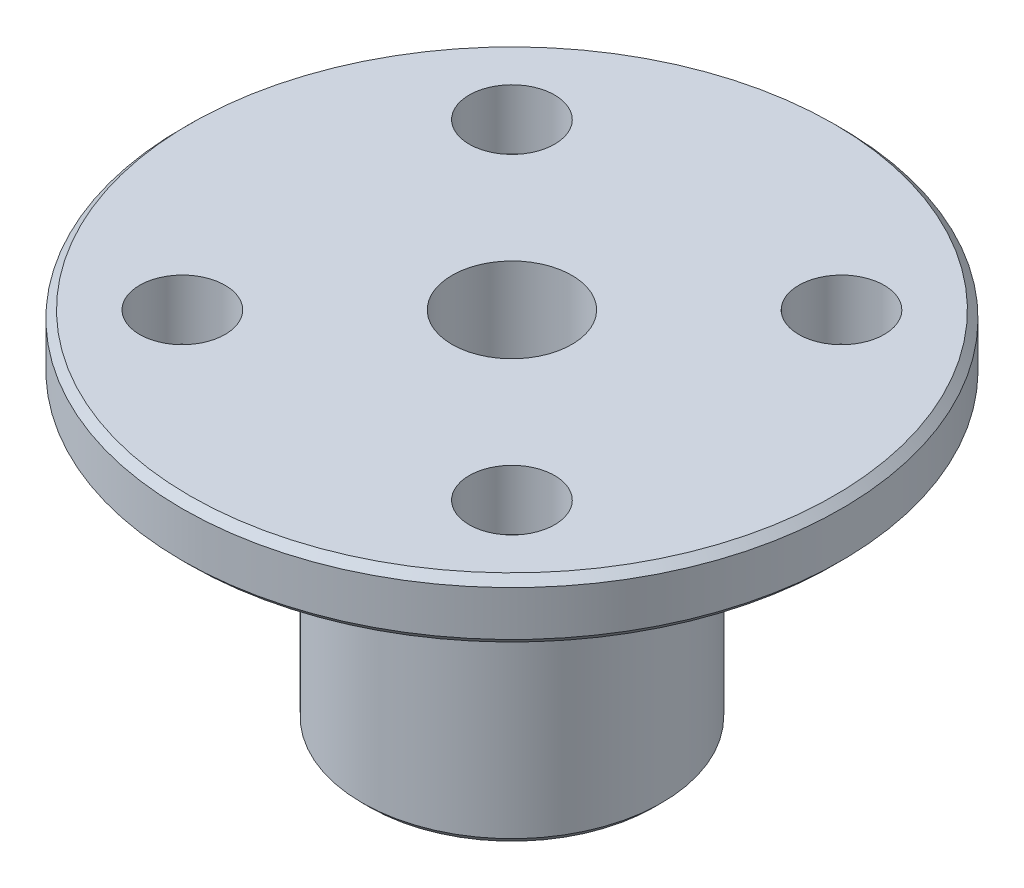
ISO-10303-21;
HEADER;
FILE_DESCRIPTION(('STEP AP214'),'2;1');
FILE_NAME('part.step','',(''),(''),'','','');
FILE_SCHEMA(('AUTOMOTIVE_DESIGN { 1 0 10303 214 1 1 1 1 }'));
ENDSEC;
DATA;
#1=APPLICATION_CONTEXT('core data for automotive mechanical design processes');
#2=APPLICATION_PROTOCOL_DEFINITION('international standard','automotive_design',2000,#1);
#3=PRODUCT_CONTEXT('',#1,'mechanical');
#4=PRODUCT('Part','Part','',(#3));
#5=PRODUCT_RELATED_PRODUCT_CATEGORY('part','',(#4));
#6=PRODUCT_DEFINITION_FORMATION('','',#4);
#7=PRODUCT_DEFINITION_CONTEXT('part definition',#1,'design');
#8=PRODUCT_DEFINITION('design','',#6,#7);
#9=PRODUCT_DEFINITION_SHAPE('','',#8);
#10=(LENGTH_UNIT() NAMED_UNIT(*) SI_UNIT(.MILLI.,.METRE.));
#11=(NAMED_UNIT(*) PLANE_ANGLE_UNIT() SI_UNIT($,.RADIAN.));
#12=(NAMED_UNIT(*) SI_UNIT($,.STERADIAN.) SOLID_ANGLE_UNIT());
#13=UNCERTAINTY_MEASURE_WITH_UNIT(LENGTH_MEASURE(1.E-05),#10,'distance_accuracy_value','');
#14=(GEOMETRIC_REPRESENTATION_CONTEXT(3) GLOBAL_UNCERTAINTY_ASSIGNED_CONTEXT((#13)) GLOBAL_UNIT_ASSIGNED_CONTEXT((#10,
#11,#12)) REPRESENTATION_CONTEXT('',''));
#15=CARTESIAN_POINT('',(0.,0.,0.));
#16=DIRECTION('',(0.,0.,1.));
#17=DIRECTION('',(1.,0.,0.));
#18=AXIS2_PLACEMENT_3D('',#15,#16,#17);
#19=CARTESIAN_POINT('',(0.,-2.,0.));
#20=DIRECTION('',(0.,1.,0.));
#21=DIRECTION('',(0.,0.,1.));
#22=AXIS2_PLACEMENT_3D('',#19,#20,#21);
#23=CYLINDRICAL_SURFACE('',#22,11.);
#24=CARTESIAN_POINT('',(0.,-1.75,0.));
#25=DIRECTION('',(0.,1.,0.));
#26=DIRECTION('',(0.,0.,1.));
#27=AXIS2_PLACEMENT_3D('',#24,#25,#26);
#28=CIRCLE('',#27,11.);
#29=CARTESIAN_POINT('',(0.,-1.75,11.));
#30=VERTEX_POINT('',#29);
#31=EDGE_CURVE('E44',#30,#30,#28,.T.);
#32=ORIENTED_EDGE('',*,*,#31,.T.);
#33=EDGE_LOOP('',(#32));
#34=FACE_BOUND('',#33,.T.);
#35=CARTESIAN_POINT('',(0.,-0.250000000000011,0.));
#36=DIRECTION('',(0.,1.,0.));
#37=DIRECTION('',(0.,0.,1.));
#38=AXIS2_PLACEMENT_3D('',#35,#36,#37);
#39=CIRCLE('',#38,11.);
#40=CARTESIAN_POINT('',(0.,-0.250000000000011,11.));
#41=VERTEX_POINT('',#40);
#42=EDGE_CURVE('E48',#41,#41,#39,.F.);
#43=ORIENTED_EDGE('',*,*,#42,.T.);
#44=EDGE_LOOP('',(#43));
#45=FACE_BOUND('',#44,.T.);
#46=ADVANCED_FACE('F36',(#34,#45),#23,.T.);
#47=CARTESIAN_POINT('',(-5.5,-2.,-5.5));
#48=DIRECTION('',(0.,1.,0.));
#49=DIRECTION('',(0.,0.,1.));
#50=AXIS2_PLACEMENT_3D('',#47,#48,#49);
#51=CYLINDRICAL_SURFACE('',#50,1.425);
#52=CARTESIAN_POINT('',(-5.5,-2.,-5.5));
#53=DIRECTION('',(0.,1.,0.));
#54=DIRECTION('',(0.,0.,1.));
#55=AXIS2_PLACEMENT_3D('',#52,#53,#54);
#56=CIRCLE('',#55,1.425);
#57=CARTESIAN_POINT('',(-5.5,-2.,-4.075));
#58=VERTEX_POINT('',#57);
#59=EDGE_CURVE('E75',#58,#58,#56,.T.);
#60=ORIENTED_EDGE('',*,*,#59,.F.);
#61=EDGE_LOOP('',(#60));
#62=FACE_BOUND('',#61,.T.);
#63=CARTESIAN_POINT('',(-5.5,0.,-5.5));
#64=DIRECTION('',(0.,1.,0.));
#65=DIRECTION('',(0.,0.,1.));
#66=AXIS2_PLACEMENT_3D('',#63,#64,#65);
#67=CIRCLE('',#66,1.425);
#68=CARTESIAN_POINT('',(-5.5,0.,-4.075));
#69=VERTEX_POINT('',#68);
#70=EDGE_CURVE('E80',#69,#69,#67,.T.);
#71=ORIENTED_EDGE('',*,*,#70,.T.);
#72=EDGE_LOOP('',(#71));
#73=FACE_BOUND('',#72,.T.);
#74=ADVANCED_FACE('F137',(#62,#73),#51,.F.);
#75=CARTESIAN_POINT('',(5.5,-2.,5.5));
#76=DIRECTION('',(0.,1.,0.));
#77=DIRECTION('',(0.,0.,1.));
#78=AXIS2_PLACEMENT_3D('',#75,#76,#77);
#79=CYLINDRICAL_SURFACE('',#78,1.425);
#80=CARTESIAN_POINT('',(5.5,-2.,5.5));
#81=DIRECTION('',(0.,1.,0.));
#82=DIRECTION('',(0.,0.,1.));
#83=AXIS2_PLACEMENT_3D('',#80,#81,#82);
#84=CIRCLE('',#83,1.425);
#85=CARTESIAN_POINT('',(5.5,-2.,6.925));
#86=VERTEX_POINT('',#85);
#87=EDGE_CURVE('E94',#86,#86,#84,.T.);
#88=ORIENTED_EDGE('',*,*,#87,.F.);
#89=EDGE_LOOP('',(#88));
#90=FACE_BOUND('',#89,.T.);
#91=CARTESIAN_POINT('',(5.5,0.,5.5));
#92=DIRECTION('',(0.,1.,0.));
#93=DIRECTION('',(0.,0.,1.));
#94=AXIS2_PLACEMENT_3D('',#91,#92,#93);
#95=CIRCLE('',#94,1.425);
#96=CARTESIAN_POINT('',(5.5,0.,6.925));
#97=VERTEX_POINT('',#96);
#98=EDGE_CURVE('E83',#97,#97,#95,.T.);
#99=ORIENTED_EDGE('',*,*,#98,.T.);
#100=EDGE_LOOP('',(#99));
#101=FACE_BOUND('',#100,.T.);
#102=ADVANCED_FACE('F141',(#90,#101),#79,.F.);
#103=CARTESIAN_POINT('',(5.5,-2.,-5.5));
#104=DIRECTION('',(0.,1.,0.));
#105=DIRECTION('',(0.,0.,1.));
#106=AXIS2_PLACEMENT_3D('',#103,#104,#105);
#107=CYLINDRICAL_SURFACE('',#106,1.425);
#108=CARTESIAN_POINT('',(5.5,-2.,-5.5));
#109=DIRECTION('',(0.,1.,0.));
#110=DIRECTION('',(0.,0.,1.));
#111=AXIS2_PLACEMENT_3D('',#108,#109,#110);
#112=CIRCLE('',#111,1.425);
#113=CARTESIAN_POINT('',(5.5,-2.,-4.075));
#114=VERTEX_POINT('',#113);
#115=EDGE_CURVE('E97',#114,#114,#112,.T.);
#116=ORIENTED_EDGE('',*,*,#115,.F.);
#117=EDGE_LOOP('',(#116));
#118=FACE_BOUND('',#117,.T.);
#119=CARTESIAN_POINT('',(5.5,0.,-5.5));
#120=DIRECTION('',(0.,1.,0.));
#121=DIRECTION('',(0.,0.,1.));
#122=AXIS2_PLACEMENT_3D('',#119,#120,#121);
#123=CIRCLE('',#122,1.425);
#124=CARTESIAN_POINT('',(5.5,0.,-4.075));
#125=VERTEX_POINT('',#124);
#126=EDGE_CURVE('E86',#125,#125,#123,.T.);
#127=ORIENTED_EDGE('',*,*,#126,.T.);
#128=EDGE_LOOP('',(#127));
#129=FACE_BOUND('',#128,.T.);
#130=ADVANCED_FACE('F110',(#118,#129),#107,.F.);
#131=CARTESIAN_POINT('',(-5.5,-2.,5.5));
#132=DIRECTION('',(0.,1.,0.));
#133=DIRECTION('',(0.,0.,1.));
#134=AXIS2_PLACEMENT_3D('',#131,#132,#133);
#135=CYLINDRICAL_SURFACE('',#134,1.425);
#136=CARTESIAN_POINT('',(-5.5,-2.,5.5));
#137=DIRECTION('',(0.,1.,0.));
#138=DIRECTION('',(0.,0.,1.));
#139=AXIS2_PLACEMENT_3D('',#136,#137,#138);
#140=CIRCLE('',#139,1.425);
#141=CARTESIAN_POINT('',(-5.5,-2.,6.925));
#142=VERTEX_POINT('',#141);
#143=EDGE_CURVE('E79',#142,#142,#140,.T.);
#144=ORIENTED_EDGE('',*,*,#143,.F.);
#145=EDGE_LOOP('',(#144));
#146=FACE_BOUND('',#145,.T.);
#147=CARTESIAN_POINT('',(-5.5,0.,5.5));
#148=DIRECTION('',(0.,1.,0.));
#149=DIRECTION('',(0.,0.,1.));
#150=AXIS2_PLACEMENT_3D('',#147,#148,#149);
#151=CIRCLE('',#150,1.425);
#152=CARTESIAN_POINT('',(-5.5,0.,6.925));
#153=VERTEX_POINT('',#152);
#154=EDGE_CURVE('E89',#153,#153,#151,.T.);
#155=ORIENTED_EDGE('',*,*,#154,.T.);
#156=EDGE_LOOP('',(#155));
#157=FACE_BOUND('',#156,.T.);
#158=ADVANCED_FACE('F106',(#146,#157),#135,.F.);
#159=CARTESIAN_POINT('',(0.,-2.,0.));
#160=DIRECTION('',(0.,1.,0.));
#161=DIRECTION('',(0.,0.,1.));
#162=AXIS2_PLACEMENT_3D('',#159,#160,#161);
#163=CYLINDRICAL_SURFACE('',#162,2.);
#164=CARTESIAN_POINT('',(0.,-11.75,0.));
#165=DIRECTION('',(0.,1.,0.));
#166=DIRECTION('',(0.,0.,1.));
#167=AXIS2_PLACEMENT_3D('',#164,#165,#166);
#168=CIRCLE('',#167,2.);
#169=CARTESIAN_POINT('',(0.,-11.75,2.));
#170=VERTEX_POINT('',#169);
#171=EDGE_CURVE('E66',#170,#170,#168,.F.);
#172=ORIENTED_EDGE('',*,*,#171,.T.);
#173=EDGE_LOOP('',(#172));
#174=FACE_BOUND('',#173,.T.);
#175=CARTESIAN_POINT('',(0.,0.,0.));
#176=DIRECTION('',(0.,1.,0.));
#177=DIRECTION('',(0.,0.,1.));
#178=AXIS2_PLACEMENT_3D('',#175,#176,#177);
#179=CIRCLE('',#178,2.);
#180=CARTESIAN_POINT('',(0.,0.,2.));
#181=VERTEX_POINT('',#180);
#182=EDGE_CURVE('E76',#181,#181,#179,.T.);
#183=ORIENTED_EDGE('',*,*,#182,.T.);
#184=EDGE_LOOP('',(#183));
#185=FACE_BOUND('',#184,.T.);
#186=ADVANCED_FACE('F109',(#174,#185),#163,.F.);
#187=CARTESIAN_POINT('',(0.,-2.,0.));
#188=DIRECTION('',(0.,1.,0.));
#189=DIRECTION('',(0.,0.,1.));
#190=AXIS2_PLACEMENT_3D('',#187,#188,#189);
#191=PLANE('',#190);
#192=CARTESIAN_POINT('',(0.,-2.,0.));
#193=DIRECTION('',(0.,1.,0.));
#194=DIRECTION('',(0.,0.,1.));
#195=AXIS2_PLACEMENT_3D('',#192,#193,#194);
#196=CIRCLE('',#195,5.25);
#197=CARTESIAN_POINT('',(0.,-2.,5.25));
#198=VERTEX_POINT('',#197);
#199=EDGE_CURVE('E60',#198,#198,#196,.T.);
#200=ORIENTED_EDGE('',*,*,#199,.T.);
#201=EDGE_LOOP('',(#200));
#202=FACE_BOUND('',#201,.T.);
#203=CARTESIAN_POINT('',(0.,-2.,0.));
#204=DIRECTION('',(0.,1.,0.));
#205=DIRECTION('',(0.,0.,1.));
#206=AXIS2_PLACEMENT_3D('',#203,#204,#205);
#207=CIRCLE('',#206,10.75);
#208=CARTESIAN_POINT('',(0.,-2.,10.75));
#209=VERTEX_POINT('',#208);
#210=EDGE_CURVE('E63',#209,#209,#207,.F.);
#211=ORIENTED_EDGE('',*,*,#210,.T.);
#212=EDGE_LOOP('',(#211));
#213=FACE_BOUND('',#212,.T.);
#214=ORIENTED_EDGE('',*,*,#143,.T.);
#215=EDGE_LOOP('',(#214));
#216=FACE_BOUND('',#215,.T.);
#217=ORIENTED_EDGE('',*,*,#115,.T.);
#218=EDGE_LOOP('',(#217));
#219=FACE_BOUND('',#218,.T.);
#220=ORIENTED_EDGE('',*,*,#87,.T.);
#221=EDGE_LOOP('',(#220));
#222=FACE_BOUND('',#221,.T.);
#223=ORIENTED_EDGE('',*,*,#59,.T.);
#224=EDGE_LOOP('',(#223));
#225=FACE_BOUND('',#224,.T.);
#226=ADVANCED_FACE('F103',(#202,#213,#216,#219,#222,#225),#191,.F.);
#227=CARTESIAN_POINT('',(0.,0.,0.));
#228=DIRECTION('',(0.,1.,0.));
#229=DIRECTION('',(0.,0.,1.));
#230=AXIS2_PLACEMENT_3D('',#227,#228,#229);
#231=PLANE('',#230);
#232=CARTESIAN_POINT('',(0.,0.,0.));
#233=DIRECTION('',(0.,1.,0.));
#234=DIRECTION('',(0.,0.,1.));
#235=AXIS2_PLACEMENT_3D('',#232,#233,#234);
#236=CIRCLE('',#235,10.75);
#237=CARTESIAN_POINT('',(0.,0.,10.75));
#238=VERTEX_POINT('',#237);
#239=EDGE_CURVE('E10',#238,#238,#236,.T.);
#240=ORIENTED_EDGE('',*,*,#239,.T.);
#241=EDGE_LOOP('',(#240));
#242=FACE_BOUND('',#241,.T.);
#243=ORIENTED_EDGE('',*,*,#154,.F.);
#244=EDGE_LOOP('',(#243));
#245=FACE_BOUND('',#244,.T.);
#246=ORIENTED_EDGE('',*,*,#126,.F.);
#247=EDGE_LOOP('',(#246));
#248=FACE_BOUND('',#247,.T.);
#249=ORIENTED_EDGE('',*,*,#98,.F.);
#250=EDGE_LOOP('',(#249));
#251=FACE_BOUND('',#250,.T.);
#252=ORIENTED_EDGE('',*,*,#70,.F.);
#253=EDGE_LOOP('',(#252));
#254=FACE_BOUND('',#253,.T.);
#255=ORIENTED_EDGE('',*,*,#182,.F.);
#256=EDGE_LOOP('',(#255));
#257=FACE_BOUND('',#256,.T.);
#258=ADVANCED_FACE('F114',(#242,#245,#248,#251,#254,#257),#231,.T.);
#259=CARTESIAN_POINT('',(0.,-12.,0.));
#260=DIRECTION('',(0.,1.,0.));
#261=DIRECTION('',(0.,0.,1.));
#262=AXIS2_PLACEMENT_3D('',#259,#260,#261);
#263=CYLINDRICAL_SURFACE('',#262,5.);
#264=CARTESIAN_POINT('',(0.,-2.25,0.));
#265=DIRECTION('',(0.,1.,0.));
#266=DIRECTION('',(0.,0.,1.));
#267=AXIS2_PLACEMENT_3D('',#264,#265,#266);
#268=CIRCLE('',#267,5.);
#269=CARTESIAN_POINT('',(0.,-2.25,5.));
#270=VERTEX_POINT('',#269);
#271=EDGE_CURVE('E52',#270,#270,#268,.F.);
#272=ORIENTED_EDGE('',*,*,#271,.T.);
#273=EDGE_LOOP('',(#272));
#274=FACE_BOUND('',#273,.T.);
#275=CARTESIAN_POINT('',(0.,-11.75,0.));
#276=DIRECTION('',(0.,1.,0.));
#277=DIRECTION('',(0.,0.,1.));
#278=AXIS2_PLACEMENT_3D('',#275,#276,#277);
#279=CIRCLE('',#278,5.);
#280=CARTESIAN_POINT('',(0.,-11.75,5.));
#281=VERTEX_POINT('',#280);
#282=EDGE_CURVE('E57',#281,#281,#279,.T.);
#283=ORIENTED_EDGE('',*,*,#282,.T.);
#284=EDGE_LOOP('',(#283));
#285=FACE_BOUND('',#284,.T.);
#286=ADVANCED_FACE('F117',(#274,#285),#263,.T.);
#287=CARTESIAN_POINT('',(0.,-12.,0.));
#288=DIRECTION('',(0.,1.,0.));
#289=DIRECTION('',(0.,0.,1.));
#290=AXIS2_PLACEMENT_3D('',#287,#288,#289);
#291=PLANE('',#290);
#292=CARTESIAN_POINT('',(0.,-12.,0.));
#293=DIRECTION('',(0.,1.,0.));
#294=DIRECTION('',(0.,0.,1.));
#295=AXIS2_PLACEMENT_3D('',#292,#293,#294);
#296=CIRCLE('',#295,2.25);
#297=CARTESIAN_POINT('',(0.,-12.,2.25));
#298=VERTEX_POINT('',#297);
#299=EDGE_CURVE('E69',#298,#298,#296,.T.);
#300=ORIENTED_EDGE('',*,*,#299,.T.);
#301=EDGE_LOOP('',(#300));
#302=FACE_BOUND('',#301,.T.);
#303=CARTESIAN_POINT('',(0.,-12.,0.));
#304=DIRECTION('',(0.,1.,0.));
#305=DIRECTION('',(0.,0.,1.));
#306=AXIS2_PLACEMENT_3D('',#303,#304,#305);
#307=CIRCLE('',#306,4.74999999999999);
#308=CARTESIAN_POINT('',(0.,-12.,4.74999999999999));
#309=VERTEX_POINT('',#308);
#310=EDGE_CURVE('E72',#309,#309,#307,.F.);
#311=ORIENTED_EDGE('',*,*,#310,.T.);
#312=EDGE_LOOP('',(#311));
#313=FACE_BOUND('',#312,.T.);
#314=ADVANCED_FACE('F160',(#302,#313),#291,.F.);
#315=CARTESIAN_POINT('',(0.,-12.,0.));
#316=DIRECTION('',(0.,-1.,0.));
#317=DIRECTION('',(0.,0.,-1.));
#318=AXIS2_PLACEMENT_3D('',#315,#316,#317);
#319=CONICAL_SURFACE('',#318,2.25,0.785398163397448);
#320=ORIENTED_EDGE('',*,*,#171,.F.);
#321=EDGE_LOOP('',(#320));
#322=FACE_BOUND('',#321,.T.);
#323=ORIENTED_EDGE('',*,*,#299,.F.);
#324=EDGE_LOOP('',(#323));
#325=FACE_BOUND('',#324,.T.);
#326=ADVANCED_FACE('F153',(#322,#325),#319,.F.);
#327=CARTESIAN_POINT('',(0.,-2.,0.));
#328=DIRECTION('',(0.,1.,0.));
#329=DIRECTION('',(0.,0.,1.));
#330=AXIS2_PLACEMENT_3D('',#327,#328,#329);
#331=CONICAL_SURFACE('',#330,5.25,0.785398163397454);
#332=ORIENTED_EDGE('',*,*,#271,.F.);
#333=EDGE_LOOP('',(#332));
#334=FACE_BOUND('',#333,.T.);
#335=ORIENTED_EDGE('',*,*,#199,.F.);
#336=EDGE_LOOP('',(#335));
#337=FACE_BOUND('',#336,.T.);
#338=ADVANCED_FACE('F159',(#334,#337),#331,.T.);
#339=CARTESIAN_POINT('',(0.,-11.75,0.));
#340=DIRECTION('',(0.,1.,0.));
#341=DIRECTION('',(0.,0.,1.));
#342=AXIS2_PLACEMENT_3D('',#339,#340,#341);
#343=CONICAL_SURFACE('',#342,5.,0.785398163397453);
#344=ORIENTED_EDGE('',*,*,#310,.F.);
#345=EDGE_LOOP('',(#344));
#346=FACE_BOUND('',#345,.T.);
#347=ORIENTED_EDGE('',*,*,#282,.F.);
#348=EDGE_LOOP('',(#347));
#349=FACE_BOUND('',#348,.T.);
#350=ADVANCED_FACE('F167',(#346,#349),#343,.T.);
#351=CARTESIAN_POINT('',(0.,-1.75,0.));
#352=DIRECTION('',(0.,1.,0.));
#353=DIRECTION('',(0.,0.,1.));
#354=AXIS2_PLACEMENT_3D('',#351,#352,#353);
#355=CONICAL_SURFACE('',#354,11.,0.785398163397455);
#356=ORIENTED_EDGE('',*,*,#210,.F.);
#357=EDGE_LOOP('',(#356));
#358=FACE_BOUND('',#357,.T.);
#359=ORIENTED_EDGE('',*,*,#31,.F.);
#360=EDGE_LOOP('',(#359));
#361=FACE_BOUND('',#360,.T.);
#362=ADVANCED_FACE('F173',(#358,#361),#355,.T.);
#363=CARTESIAN_POINT('',(0.,0.,0.));
#364=DIRECTION('',(0.,-1.,0.));
#365=DIRECTION('',(0.,0.,-1.));
#366=AXIS2_PLACEMENT_3D('',#363,#364,#365);
#367=CONICAL_SURFACE('',#366,10.75,0.785398163397428);
#368=ORIENTED_EDGE('',*,*,#42,.F.);
#369=EDGE_LOOP('',(#368));
#370=FACE_BOUND('',#369,.T.);
#371=ORIENTED_EDGE('',*,*,#239,.F.);
#372=EDGE_LOOP('',(#371));
#373=FACE_BOUND('',#372,.T.);
#374=ADVANCED_FACE('F39',(#370,#373),#367,.T.);
#375=CLOSED_SHELL('',(#46,#74,#102,#130,#158,#186,#226,#258,#286,#314,#326,#338,#350,#362,#374));
#376=MANIFOLD_SOLID_BREP('B2',#375);
#377=ADVANCED_BREP_SHAPE_REPRESENTATION('',(#18,#376),#14);
#378=SHAPE_DEFINITION_REPRESENTATION(#9,#377);
ENDSEC;
END-ISO-10303-21;
